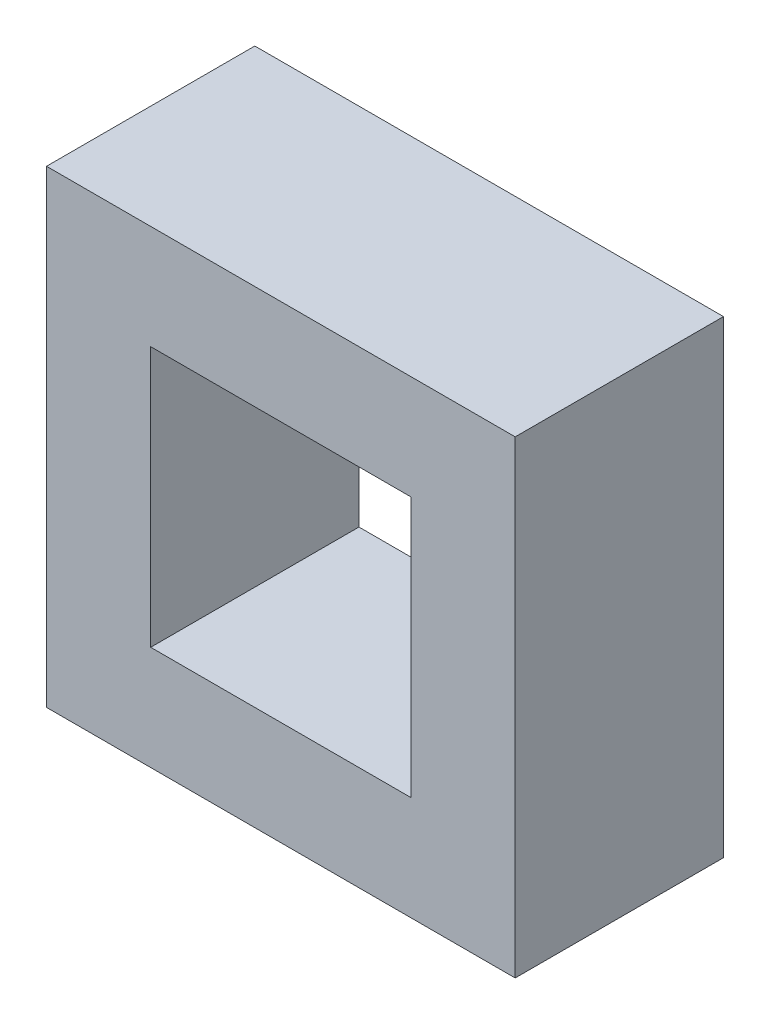
ISO-10303-21;
HEADER;
FILE_DESCRIPTION(('STEP AP214'),'2;1');
FILE_NAME('part.step','',(''),(''),'','','');
FILE_SCHEMA(('AUTOMOTIVE_DESIGN { 1 0 10303 214 1 1 1 1 }'));
ENDSEC;
DATA;
#1=APPLICATION_CONTEXT('core data for automotive mechanical design processes');
#2=APPLICATION_PROTOCOL_DEFINITION('international standard','automotive_design',2000,#1);
#3=PRODUCT_CONTEXT('',#1,'mechanical');
#4=PRODUCT('Part','Part','',(#3));
#5=PRODUCT_RELATED_PRODUCT_CATEGORY('part','',(#4));
#6=PRODUCT_DEFINITION_FORMATION('','',#4);
#7=PRODUCT_DEFINITION_CONTEXT('part definition',#1,'design');
#8=PRODUCT_DEFINITION('design','',#6,#7);
#9=PRODUCT_DEFINITION_SHAPE('','',#8);
#10=(LENGTH_UNIT() NAMED_UNIT(*) SI_UNIT(.MILLI.,.METRE.));
#11=(NAMED_UNIT(*) PLANE_ANGLE_UNIT() SI_UNIT($,.RADIAN.));
#12=(NAMED_UNIT(*) SI_UNIT($,.STERADIAN.) SOLID_ANGLE_UNIT());
#13=UNCERTAINTY_MEASURE_WITH_UNIT(LENGTH_MEASURE(1.E-05),#10,'distance_accuracy_value','');
#14=(GEOMETRIC_REPRESENTATION_CONTEXT(3) GLOBAL_UNCERTAINTY_ASSIGNED_CONTEXT((#13)) GLOBAL_UNIT_ASSIGNED_CONTEXT((#10,
#11,#12)) REPRESENTATION_CONTEXT('',''));
#15=CARTESIAN_POINT('',(0.,0.,0.));
#16=DIRECTION('',(0.,0.,1.));
#17=DIRECTION('',(1.,0.,0.));
#18=AXIS2_PLACEMENT_3D('',#15,#16,#17);
#19=CARTESIAN_POINT('',(0.,0.,20.));
#20=DIRECTION('',(0.,0.,-1.));
#21=DIRECTION('',(-1.,0.,0.));
#22=AXIS2_PLACEMENT_3D('',#19,#20,#21);
#23=PLANE('',#22);
#24=DIRECTION('',(0.,-1.,0.));
#25=VECTOR('',#24,1.);
#26=CARTESIAN_POINT('',(-22.5,-22.5,20.));
#27=LINE('',#26,#25);
#28=CARTESIAN_POINT('',(-22.5,22.5,20.));
#29=VERTEX_POINT('',#28);
#30=CARTESIAN_POINT('',(-22.5,-22.5,20.));
#31=VERTEX_POINT('',#30);
#32=EDGE_CURVE('E159',#29,#31,#27,.T.);
#33=ORIENTED_EDGE('',*,*,#32,.T.);
#34=DIRECTION('',(1.,0.,0.));
#35=VECTOR('',#34,1.);
#36=CARTESIAN_POINT('',(-22.5,-22.5,20.));
#37=LINE('',#36,#35);
#38=CARTESIAN_POINT('',(22.5,-22.5,20.));
#39=VERTEX_POINT('',#38);
#40=EDGE_CURVE('E163',#31,#39,#37,.T.);
#41=ORIENTED_EDGE('',*,*,#40,.T.);
#42=DIRECTION('',(0.,1.,0.));
#43=VECTOR('',#42,1.);
#44=CARTESIAN_POINT('',(22.5,-22.5,20.));
#45=LINE('',#44,#43);
#46=CARTESIAN_POINT('',(22.5,22.5,20.));
#47=VERTEX_POINT('',#46);
#48=EDGE_CURVE('E167',#39,#47,#45,.T.);
#49=ORIENTED_EDGE('',*,*,#48,.T.);
#50=DIRECTION('',(-1.,0.,0.));
#51=VECTOR('',#50,1.);
#52=CARTESIAN_POINT('',(-22.5,22.5,20.));
#53=LINE('',#52,#51);
#54=EDGE_CURVE('E170',#47,#29,#53,.T.);
#55=ORIENTED_EDGE('',*,*,#54,.T.);
#56=EDGE_LOOP('',(#33,#41,#49,#55));
#57=FACE_BOUND('',#56,.T.);
#58=DIRECTION('',(0.,-1.,0.));
#59=VECTOR('',#58,1.);
#60=CARTESIAN_POINT('',(-12.5,12.5,20.));
#61=LINE('',#60,#59);
#62=CARTESIAN_POINT('',(-12.5,12.5,20.));
#63=VERTEX_POINT('',#62);
#64=CARTESIAN_POINT('',(-12.5,-12.5,20.));
#65=VERTEX_POINT('',#64);
#66=EDGE_CURVE('E111',#63,#65,#61,.T.);
#67=ORIENTED_EDGE('',*,*,#66,.F.);
#68=DIRECTION('',(-1.,0.,0.));
#69=VECTOR('',#68,1.);
#70=CARTESIAN_POINT('',(-12.5,12.5,20.));
#71=LINE('',#70,#69);
#72=CARTESIAN_POINT('',(12.5,12.5,20.));
#73=VERTEX_POINT('',#72);
#74=EDGE_CURVE('E137',#73,#63,#71,.T.);
#75=ORIENTED_EDGE('',*,*,#74,.F.);
#76=DIRECTION('',(0.,1.,0.));
#77=VECTOR('',#76,1.);
#78=CARTESIAN_POINT('',(12.5,12.5,20.));
#79=LINE('',#78,#77);
#80=CARTESIAN_POINT('',(12.5,-12.5,20.));
#81=VERTEX_POINT('',#80);
#82=EDGE_CURVE('E133',#81,#73,#79,.T.);
#83=ORIENTED_EDGE('',*,*,#82,.F.);
#84=DIRECTION('',(1.,0.,0.));
#85=VECTOR('',#84,1.);
#86=CARTESIAN_POINT('',(-12.5,-12.5,20.));
#87=LINE('',#86,#85);
#88=EDGE_CURVE('E120',#65,#81,#87,.T.);
#89=ORIENTED_EDGE('',*,*,#88,.F.);
#90=EDGE_LOOP('',(#67,#75,#83,#89));
#91=FACE_BOUND('',#90,.T.);
#92=ADVANCED_FACE('F45',(#57,#91),#23,.F.);
#93=CARTESIAN_POINT('',(0.,0.,0.));
#94=DIRECTION('',(0.,0.,-1.));
#95=DIRECTION('',(-1.,0.,0.));
#96=AXIS2_PLACEMENT_3D('',#93,#94,#95);
#97=PLANE('',#96);
#98=DIRECTION('',(0.,-1.,0.));
#99=VECTOR('',#98,1.);
#100=CARTESIAN_POINT('',(-22.5,-22.5,0.));
#101=LINE('',#100,#99);
#102=CARTESIAN_POINT('',(-22.5,22.5,0.));
#103=VERTEX_POINT('',#102);
#104=CARTESIAN_POINT('',(-22.5,-22.5,0.));
#105=VERTEX_POINT('',#104);
#106=EDGE_CURVE('E129',#103,#105,#101,.T.);
#107=ORIENTED_EDGE('',*,*,#106,.F.);
#108=DIRECTION('',(-1.,0.,0.));
#109=VECTOR('',#108,1.);
#110=CARTESIAN_POINT('',(-22.5,22.5,0.));
#111=LINE('',#110,#109);
#112=CARTESIAN_POINT('',(22.5,22.5,0.));
#113=VERTEX_POINT('',#112);
#114=EDGE_CURVE('E164',#113,#103,#111,.T.);
#115=ORIENTED_EDGE('',*,*,#114,.F.);
#116=DIRECTION('',(0.,1.,0.));
#117=VECTOR('',#116,1.);
#118=CARTESIAN_POINT('',(22.5,-22.5,0.));
#119=LINE('',#118,#117);
#120=CARTESIAN_POINT('',(22.5,-22.5,0.));
#121=VERTEX_POINT('',#120);
#122=EDGE_CURVE('E180',#121,#113,#119,.T.);
#123=ORIENTED_EDGE('',*,*,#122,.F.);
#124=DIRECTION('',(1.,0.,0.));
#125=VECTOR('',#124,1.);
#126=CARTESIAN_POINT('',(-22.5,-22.5,0.));
#127=LINE('',#126,#125);
#128=EDGE_CURVE('E177',#105,#121,#127,.T.);
#129=ORIENTED_EDGE('',*,*,#128,.F.);
#130=EDGE_LOOP('',(#107,#115,#123,#129));
#131=FACE_BOUND('',#130,.T.);
#132=DIRECTION('',(-1.,0.,0.));
#133=VECTOR('',#132,1.);
#134=CARTESIAN_POINT('',(-12.5,12.5,0.));
#135=LINE('',#134,#133);
#136=CARTESIAN_POINT('',(12.5,12.5,0.));
#137=VERTEX_POINT('',#136);
#138=CARTESIAN_POINT('',(-12.5,12.5,0.));
#139=VERTEX_POINT('',#138);
#140=EDGE_CURVE('E121',#137,#139,#135,.T.);
#141=ORIENTED_EDGE('',*,*,#140,.T.);
#142=DIRECTION('',(0.,-1.,0.));
#143=VECTOR('',#142,1.);
#144=CARTESIAN_POINT('',(-12.5,12.5,0.));
#145=LINE('',#144,#143);
#146=CARTESIAN_POINT('',(-12.5,-12.5,0.));
#147=VERTEX_POINT('',#146);
#148=EDGE_CURVE('E69',#139,#147,#145,.T.);
#149=ORIENTED_EDGE('',*,*,#148,.T.);
#150=DIRECTION('',(1.,0.,0.));
#151=VECTOR('',#150,1.);
#152=CARTESIAN_POINT('',(-12.5,-12.5,0.));
#153=LINE('',#152,#151);
#154=CARTESIAN_POINT('',(12.5,-12.5,0.));
#155=VERTEX_POINT('',#154);
#156=EDGE_CURVE('E127',#147,#155,#153,.T.);
#157=ORIENTED_EDGE('',*,*,#156,.T.);
#158=DIRECTION('',(0.,1.,0.));
#159=VECTOR('',#158,1.);
#160=CARTESIAN_POINT('',(12.5,12.5,0.));
#161=LINE('',#160,#159);
#162=EDGE_CURVE('E146',#155,#137,#161,.T.);
#163=ORIENTED_EDGE('',*,*,#162,.T.);
#164=EDGE_LOOP('',(#141,#149,#157,#163));
#165=FACE_BOUND('',#164,.T.);
#166=ADVANCED_FACE('F203',(#131,#165),#97,.T.);
#167=CARTESIAN_POINT('',(-22.5,-22.5,20.));
#168=DIRECTION('',(1.,0.,0.));
#169=DIRECTION('',(0.,1.,0.));
#170=AXIS2_PLACEMENT_3D('',#167,#168,#169);
#171=PLANE('',#170);
#172=ORIENTED_EDGE('',*,*,#106,.T.);
#173=DIRECTION('',(0.,0.,-1.));
#174=VECTOR('',#173,1.);
#175=CARTESIAN_POINT('',(-22.5,-22.5,20.));
#176=LINE('',#175,#174);
#177=EDGE_CURVE('E11',#31,#105,#176,.T.);
#178=ORIENTED_EDGE('',*,*,#177,.F.);
#179=ORIENTED_EDGE('',*,*,#32,.F.);
#180=DIRECTION('',(0.,0.,-1.));
#181=VECTOR('',#180,1.);
#182=CARTESIAN_POINT('',(-22.5,22.5,20.));
#183=LINE('',#182,#181);
#184=EDGE_CURVE('E173',#29,#103,#183,.T.);
#185=ORIENTED_EDGE('',*,*,#184,.T.);
#186=EDGE_LOOP('',(#172,#178,#179,#185));
#187=FACE_BOUND('',#186,.T.);
#188=ADVANCED_FACE('F47',(#187),#171,.F.);
#189=CARTESIAN_POINT('',(-22.5,-22.5,20.));
#190=DIRECTION('',(0.,1.,0.));
#191=DIRECTION('',(0.,0.,1.));
#192=AXIS2_PLACEMENT_3D('',#189,#190,#191);
#193=PLANE('',#192);
#194=ORIENTED_EDGE('',*,*,#128,.T.);
#195=DIRECTION('',(0.,0.,-1.));
#196=VECTOR('',#195,1.);
#197=CARTESIAN_POINT('',(22.5,-22.5,20.));
#198=LINE('',#197,#196);
#199=EDGE_CURVE('E54',#39,#121,#198,.T.);
#200=ORIENTED_EDGE('',*,*,#199,.F.);
#201=ORIENTED_EDGE('',*,*,#40,.F.);
#202=ORIENTED_EDGE('',*,*,#177,.T.);
#203=EDGE_LOOP('',(#194,#200,#201,#202));
#204=FACE_BOUND('',#203,.T.);
#205=ADVANCED_FACE('F213',(#204),#193,.F.);
#206=CARTESIAN_POINT('',(22.5,-22.5,20.));
#207=DIRECTION('',(-1.,0.,0.));
#208=DIRECTION('',(0.,-1.,0.));
#209=AXIS2_PLACEMENT_3D('',#206,#207,#208);
#210=PLANE('',#209);
#211=ORIENTED_EDGE('',*,*,#122,.T.);
#212=DIRECTION('',(0.,0.,-1.));
#213=VECTOR('',#212,1.);
#214=CARTESIAN_POINT('',(22.5,22.5,20.));
#215=LINE('',#214,#213);
#216=EDGE_CURVE('E188',#47,#113,#215,.T.);
#217=ORIENTED_EDGE('',*,*,#216,.F.);
#218=ORIENTED_EDGE('',*,*,#48,.F.);
#219=ORIENTED_EDGE('',*,*,#199,.T.);
#220=EDGE_LOOP('',(#211,#217,#218,#219));
#221=FACE_BOUND('',#220,.T.);
#222=ADVANCED_FACE('F197',(#221),#210,.F.);
#223=CARTESIAN_POINT('',(-22.5,22.5,20.));
#224=DIRECTION('',(0.,-1.,0.));
#225=DIRECTION('',(0.,0.,-1.));
#226=AXIS2_PLACEMENT_3D('',#223,#224,#225);
#227=PLANE('',#226);
#228=ORIENTED_EDGE('',*,*,#114,.T.);
#229=ORIENTED_EDGE('',*,*,#184,.F.);
#230=ORIENTED_EDGE('',*,*,#54,.F.);
#231=ORIENTED_EDGE('',*,*,#216,.T.);
#232=EDGE_LOOP('',(#228,#229,#230,#231));
#233=FACE_BOUND('',#232,.T.);
#234=ADVANCED_FACE('F207',(#233),#227,.F.);
#235=CARTESIAN_POINT('',(-12.5,12.5,20.));
#236=DIRECTION('',(1.,0.,0.));
#237=DIRECTION('',(0.,1.,0.));
#238=AXIS2_PLACEMENT_3D('',#235,#236,#237);
#239=PLANE('',#238);
#240=ORIENTED_EDGE('',*,*,#148,.F.);
#241=DIRECTION('',(0.,0.,-1.));
#242=VECTOR('',#241,1.);
#243=CARTESIAN_POINT('',(-12.5,12.5,20.));
#244=LINE('',#243,#242);
#245=EDGE_CURVE('E115',#63,#139,#244,.T.);
#246=ORIENTED_EDGE('',*,*,#245,.F.);
#247=ORIENTED_EDGE('',*,*,#66,.T.);
#248=DIRECTION('',(0.,0.,-1.));
#249=VECTOR('',#248,1.);
#250=CARTESIAN_POINT('',(-12.5,-12.5,20.));
#251=LINE('',#250,#249);
#252=EDGE_CURVE('E114',#65,#147,#251,.T.);
#253=ORIENTED_EDGE('',*,*,#252,.T.);
#254=EDGE_LOOP('',(#240,#246,#247,#253));
#255=FACE_BOUND('',#254,.T.);
#256=ADVANCED_FACE('F113',(#255),#239,.T.);
#257=CARTESIAN_POINT('',(-12.5,-12.5,20.));
#258=DIRECTION('',(0.,1.,0.));
#259=DIRECTION('',(-1.,0.,0.));
#260=AXIS2_PLACEMENT_3D('',#257,#258,#259);
#261=PLANE('',#260);
#262=ORIENTED_EDGE('',*,*,#156,.F.);
#263=ORIENTED_EDGE('',*,*,#252,.F.);
#264=ORIENTED_EDGE('',*,*,#88,.T.);
#265=DIRECTION('',(0.,0.,-1.));
#266=VECTOR('',#265,1.);
#267=CARTESIAN_POINT('',(12.5,-12.5,20.));
#268=LINE('',#267,#266);
#269=EDGE_CURVE('E130',#81,#155,#268,.T.);
#270=ORIENTED_EDGE('',*,*,#269,.T.);
#271=EDGE_LOOP('',(#262,#263,#264,#270));
#272=FACE_BOUND('',#271,.T.);
#273=ADVANCED_FACE('F124',(#272),#261,.T.);
#274=CARTESIAN_POINT('',(12.5,12.5,20.));
#275=DIRECTION('',(-1.,0.,0.));
#276=DIRECTION('',(0.,-1.,0.));
#277=AXIS2_PLACEMENT_3D('',#274,#275,#276);
#278=PLANE('',#277);
#279=ORIENTED_EDGE('',*,*,#162,.F.);
#280=ORIENTED_EDGE('',*,*,#269,.F.);
#281=ORIENTED_EDGE('',*,*,#82,.T.);
#282=DIRECTION('',(0.,0.,-1.));
#283=VECTOR('',#282,1.);
#284=CARTESIAN_POINT('',(12.5,12.5,20.));
#285=LINE('',#284,#283);
#286=EDGE_CURVE('E61',#73,#137,#285,.T.);
#287=ORIENTED_EDGE('',*,*,#286,.T.);
#288=EDGE_LOOP('',(#279,#280,#281,#287));
#289=FACE_BOUND('',#288,.T.);
#290=ADVANCED_FACE('F236',(#289),#278,.T.);
#291=CARTESIAN_POINT('',(-12.5,12.5,20.));
#292=DIRECTION('',(0.,-1.,0.));
#293=DIRECTION('',(0.,0.,-1.));
#294=AXIS2_PLACEMENT_3D('',#291,#292,#293);
#295=PLANE('',#294);
#296=ORIENTED_EDGE('',*,*,#140,.F.);
#297=ORIENTED_EDGE('',*,*,#286,.F.);
#298=ORIENTED_EDGE('',*,*,#74,.T.);
#299=ORIENTED_EDGE('',*,*,#245,.T.);
#300=EDGE_LOOP('',(#296,#297,#298,#299));
#301=FACE_BOUND('',#300,.T.);
#302=ADVANCED_FACE('F240',(#301),#295,.T.);
#303=CLOSED_SHELL('',(#92,#166,#188,#205,#222,#234,#256,#273,#290,#302));
#304=MANIFOLD_SOLID_BREP('B2',#303);
#305=ADVANCED_BREP_SHAPE_REPRESENTATION('',(#18,#304),#14);
#306=SHAPE_DEFINITION_REPRESENTATION(#9,#305);
ENDSEC;
END-ISO-10303-21;
